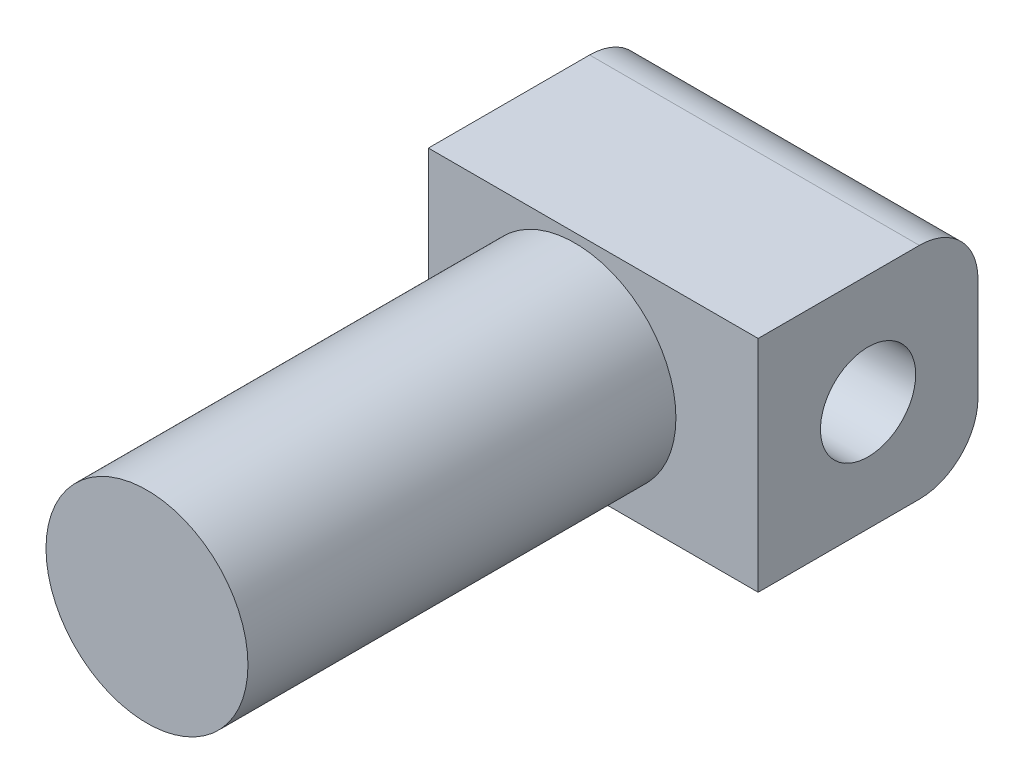
ISO-10303-21;
HEADER;
FILE_DESCRIPTION(('STEP AP214'),'2;1');
FILE_NAME('part.step','',(''),(''),'','','');
FILE_SCHEMA(('AUTOMOTIVE_DESIGN { 1 0 10303 214 1 1 1 1 }'));
ENDSEC;
DATA;
#1=APPLICATION_CONTEXT('core data for automotive mechanical design processes');
#2=APPLICATION_PROTOCOL_DEFINITION('international standard','automotive_design',2000,#1);
#3=PRODUCT_CONTEXT('',#1,'mechanical');
#4=PRODUCT('Part','Part','',(#3));
#5=PRODUCT_RELATED_PRODUCT_CATEGORY('part','',(#4));
#6=PRODUCT_DEFINITION_FORMATION('','',#4);
#7=PRODUCT_DEFINITION_CONTEXT('part definition',#1,'design');
#8=PRODUCT_DEFINITION('design','',#6,#7);
#9=PRODUCT_DEFINITION_SHAPE('','',#8);
#10=(LENGTH_UNIT() NAMED_UNIT(*) SI_UNIT(.MILLI.,.METRE.));
#11=(NAMED_UNIT(*) PLANE_ANGLE_UNIT() SI_UNIT($,.RADIAN.));
#12=(NAMED_UNIT(*) SI_UNIT($,.STERADIAN.) SOLID_ANGLE_UNIT());
#13=UNCERTAINTY_MEASURE_WITH_UNIT(LENGTH_MEASURE(1.E-05),#10,'distance_accuracy_value','');
#14=(GEOMETRIC_REPRESENTATION_CONTEXT(3) GLOBAL_UNCERTAINTY_ASSIGNED_CONTEXT((#13)) GLOBAL_UNIT_ASSIGNED_CONTEXT((#10,
#11,#12)) REPRESENTATION_CONTEXT('',''));
#15=CARTESIAN_POINT('',(0.,0.,0.));
#16=DIRECTION('',(0.,0.,1.));
#17=DIRECTION('',(1.,0.,0.));
#18=AXIS2_PLACEMENT_3D('',#15,#16,#17);
#19=CARTESIAN_POINT('',(0.,0.,7.62));
#20=DIRECTION('',(0.,-1.,0.));
#21=DIRECTION('',(1.,0.,0.));
#22=AXIS2_PLACEMENT_3D('',#19,#20,#21);
#23=PLANE('',#22);
#24=DIRECTION('',(0.,0.,-1.));
#25=VECTOR('',#24,1.);
#26=CARTESIAN_POINT('',(0.,0.,7.62));
#27=LINE('',#26,#25);
#28=CARTESIAN_POINT('',(0.,0.,7.62));
#29=VERTEX_POINT('',#28);
#30=CARTESIAN_POINT('',(0.,0.,2.032));
#31=VERTEX_POINT('',#30);
#32=EDGE_CURVE('E156',#29,#31,#27,.T.);
#33=ORIENTED_EDGE('',*,*,#32,.T.);
#34=DIRECTION('',(-1.,0.,0.));
#35=VECTOR('',#34,1.);
#36=CARTESIAN_POINT('',(0.,0.,2.032));
#37=LINE('',#36,#35);
#38=CARTESIAN_POINT('',(-11.43,0.,2.032));
#39=VERTEX_POINT('',#38);
#40=EDGE_CURVE('E126',#31,#39,#37,.T.);
#41=ORIENTED_EDGE('',*,*,#40,.T.);
#42=DIRECTION('',(0.,0.,-1.));
#43=VECTOR('',#42,1.);
#44=CARTESIAN_POINT('',(-11.43,0.,7.62));
#45=LINE('',#44,#43);
#46=CARTESIAN_POINT('',(-11.43,0.,7.62));
#47=VERTEX_POINT('',#46);
#48=EDGE_CURVE('E105',#47,#39,#45,.T.);
#49=ORIENTED_EDGE('',*,*,#48,.F.);
#50=DIRECTION('',(-1.,0.,0.));
#51=VECTOR('',#50,1.);
#52=CARTESIAN_POINT('',(0.,0.,7.62));
#53=LINE('',#52,#51);
#54=EDGE_CURVE('E112',#29,#47,#53,.T.);
#55=ORIENTED_EDGE('',*,*,#54,.F.);
#56=EDGE_LOOP('',(#33,#41,#49,#55));
#57=FACE_BOUND('',#56,.T.);
#58=ADVANCED_FACE('F45',(#57),#23,.F.);
#59=CARTESIAN_POINT('',(-11.43,0.,7.62));
#60=DIRECTION('',(1.,0.,0.));
#61=DIRECTION('',(0.,1.,0.));
#62=AXIS2_PLACEMENT_3D('',#59,#60,#61);
#63=PLANE('',#62);
#64=CARTESIAN_POINT('',(-11.43,-3.81,3.81));
#65=DIRECTION('',(1.,0.,0.));
#66=DIRECTION('',(0.,0.,-1.));
#67=AXIS2_PLACEMENT_3D('',#64,#65,#66);
#68=CIRCLE('',#67,1.65);
#69=CARTESIAN_POINT('',(-11.43,-3.81,2.16));
#70=VERTEX_POINT('',#69);
#71=EDGE_CURVE('E172',#70,#70,#68,.T.);
#72=ORIENTED_EDGE('',*,*,#71,.T.);
#73=EDGE_LOOP('',(#72));
#74=FACE_BOUND('',#73,.T.);
#75=ORIENTED_EDGE('',*,*,#48,.T.);
#76=CARTESIAN_POINT('',(-11.43,-2.032,2.032));
#77=DIRECTION('',(1.,0.,0.));
#78=DIRECTION('',(0.,1.,0.));
#79=AXIS2_PLACEMENT_3D('',#76,#77,#78);
#80=CIRCLE('',#79,2.032);
#81=CARTESIAN_POINT('',(-11.43,-2.032,0.));
#82=VERTEX_POINT('',#81);
#83=EDGE_CURVE('E143',#39,#82,#80,.F.);
#84=ORIENTED_EDGE('',*,*,#83,.T.);
#85=DIRECTION('',(0.,-1.,0.));
#86=VECTOR('',#85,1.);
#87=CARTESIAN_POINT('',(-11.43,0.,0.));
#88=LINE('',#87,#86);
#89=CARTESIAN_POINT('',(-11.43,-5.588,0.));
#90=VERTEX_POINT('',#89);
#91=EDGE_CURVE('E162',#82,#90,#88,.T.);
#92=ORIENTED_EDGE('',*,*,#91,.T.);
#93=CARTESIAN_POINT('',(-11.43,-5.588,2.032));
#94=DIRECTION('',(1.,0.,0.));
#95=DIRECTION('',(0.,1.,0.));
#96=AXIS2_PLACEMENT_3D('',#93,#94,#95);
#97=CIRCLE('',#96,2.032);
#98=CARTESIAN_POINT('',(-11.43,-7.62,2.032));
#99=VERTEX_POINT('',#98);
#100=EDGE_CURVE('E140',#90,#99,#97,.F.);
#101=ORIENTED_EDGE('',*,*,#100,.T.);
#102=DIRECTION('',(0.,0.,-1.));
#103=VECTOR('',#102,1.);
#104=CARTESIAN_POINT('',(-11.43,-7.62,7.62));
#105=LINE('',#104,#103);
#106=CARTESIAN_POINT('',(-11.43,-7.62,7.62));
#107=VERTEX_POINT('',#106);
#108=EDGE_CURVE('E107',#107,#99,#105,.T.);
#109=ORIENTED_EDGE('',*,*,#108,.F.);
#110=DIRECTION('',(0.,-1.,0.));
#111=VECTOR('',#110,1.);
#112=CARTESIAN_POINT('',(-11.43,0.,7.62));
#113=LINE('',#112,#111);
#114=EDGE_CURVE('E101',#47,#107,#113,.T.);
#115=ORIENTED_EDGE('',*,*,#114,.F.);
#116=EDGE_LOOP('',(#75,#84,#92,#101,#109,#115));
#117=FACE_BOUND('',#116,.T.);
#118=ADVANCED_FACE('F103',(#74,#117),#63,.F.);
#119=CARTESIAN_POINT('',(0.,-7.62,7.62));
#120=DIRECTION('',(0.,1.,0.));
#121=DIRECTION('',(0.,0.,1.));
#122=AXIS2_PLACEMENT_3D('',#119,#120,#121);
#123=PLANE('',#122);
#124=ORIENTED_EDGE('',*,*,#108,.T.);
#125=DIRECTION('',(1.,0.,0.));
#126=VECTOR('',#125,1.);
#127=CARTESIAN_POINT('',(0.,-7.62,2.032));
#128=LINE('',#127,#126);
#129=CARTESIAN_POINT('',(0.,-7.62,2.032));
#130=VERTEX_POINT('',#129);
#131=EDGE_CURVE('E11',#99,#130,#128,.T.);
#132=ORIENTED_EDGE('',*,*,#131,.T.);
#133=DIRECTION('',(0.,0.,-1.));
#134=VECTOR('',#133,1.);
#135=CARTESIAN_POINT('',(0.,-7.62,7.62));
#136=LINE('',#135,#134);
#137=CARTESIAN_POINT('',(0.,-7.62,7.62));
#138=VERTEX_POINT('',#137);
#139=EDGE_CURVE('E134',#138,#130,#136,.T.);
#140=ORIENTED_EDGE('',*,*,#139,.F.);
#141=DIRECTION('',(1.,0.,0.));
#142=VECTOR('',#141,1.);
#143=CARTESIAN_POINT('',(0.,-7.62,7.62));
#144=LINE('',#143,#142);
#145=EDGE_CURVE('E111',#107,#138,#144,.T.);
#146=ORIENTED_EDGE('',*,*,#145,.F.);
#147=EDGE_LOOP('',(#124,#132,#140,#146));
#148=FACE_BOUND('',#147,.T.);
#149=ADVANCED_FACE('F180',(#148),#123,.F.);
#150=CARTESIAN_POINT('',(0.,0.,7.62));
#151=DIRECTION('',(-1.,0.,0.));
#152=DIRECTION('',(0.,0.,1.));
#153=AXIS2_PLACEMENT_3D('',#150,#151,#152);
#154=PLANE('',#153);
#155=CARTESIAN_POINT('',(0.,-3.81,3.81));
#156=DIRECTION('',(1.,0.,0.));
#157=DIRECTION('',(0.,0.,-1.));
#158=AXIS2_PLACEMENT_3D('',#155,#156,#157);
#159=CIRCLE('',#158,1.64999999999999);
#160=CARTESIAN_POINT('',(0.,-3.81,2.16000000000001));
#161=VERTEX_POINT('',#160);
#162=EDGE_CURVE('E221',#161,#161,#159,.T.);
#163=ORIENTED_EDGE('',*,*,#162,.F.);
#164=EDGE_LOOP('',(#163));
#165=FACE_BOUND('',#164,.T.);
#166=DIRECTION('',(0.,1.,0.));
#167=VECTOR('',#166,1.);
#168=CARTESIAN_POINT('',(0.,0.,0.));
#169=LINE('',#168,#167);
#170=CARTESIAN_POINT('',(0.,-5.588,0.));
#171=VERTEX_POINT('',#170);
#172=CARTESIAN_POINT('',(0.,-2.032,0.));
#173=VERTEX_POINT('',#172);
#174=EDGE_CURVE('E122',#171,#173,#169,.T.);
#175=ORIENTED_EDGE('',*,*,#174,.T.);
#176=CARTESIAN_POINT('',(0.,-2.032,2.032));
#177=DIRECTION('',(-1.,0.,0.));
#178=DIRECTION('',(0.,0.,1.));
#179=AXIS2_PLACEMENT_3D('',#176,#177,#178);
#180=CIRCLE('',#179,2.032);
#181=EDGE_CURVE('E54',#173,#31,#180,.F.);
#182=ORIENTED_EDGE('',*,*,#181,.T.);
#183=ORIENTED_EDGE('',*,*,#32,.F.);
#184=DIRECTION('',(0.,1.,0.));
#185=VECTOR('',#184,1.);
#186=CARTESIAN_POINT('',(0.,0.,7.62));
#187=LINE('',#186,#185);
#188=EDGE_CURVE('E117',#138,#29,#187,.T.);
#189=ORIENTED_EDGE('',*,*,#188,.F.);
#190=ORIENTED_EDGE('',*,*,#139,.T.);
#191=CARTESIAN_POINT('',(0.,-5.588,2.032));
#192=DIRECTION('',(-1.,0.,0.));
#193=DIRECTION('',(0.,0.,1.));
#194=AXIS2_PLACEMENT_3D('',#191,#192,#193);
#195=CIRCLE('',#194,2.032);
#196=EDGE_CURVE('E61',#130,#171,#195,.F.);
#197=ORIENTED_EDGE('',*,*,#196,.T.);
#198=EDGE_LOOP('',(#175,#182,#183,#189,#190,#197));
#199=FACE_BOUND('',#198,.T.);
#200=ADVANCED_FACE('F155',(#165,#199),#154,.F.);
#201=CARTESIAN_POINT('',(0.,0.,7.62));
#202=DIRECTION('',(0.,0.,1.));
#203=DIRECTION('',(1.,0.,0.));
#204=AXIS2_PLACEMENT_3D('',#201,#202,#203);
#205=PLANE('',#204);
#206=CARTESIAN_POINT('',(-6.35,-3.81,7.62));
#207=DIRECTION('',(0.,0.,1.));
#208=DIRECTION('',(1.,0.,0.));
#209=AXIS2_PLACEMENT_3D('',#206,#207,#208);
#210=CIRCLE('',#209,3.499999985);
#211=CARTESIAN_POINT('',(-2.850000015,-3.81,7.62));
#212=VERTEX_POINT('',#211);
#213=EDGE_CURVE('E128',#212,#212,#210,.T.);
#214=ORIENTED_EDGE('',*,*,#213,.F.);
#215=EDGE_LOOP('',(#214));
#216=FACE_BOUND('',#215,.T.);
#217=ORIENTED_EDGE('',*,*,#54,.T.);
#218=ORIENTED_EDGE('',*,*,#114,.T.);
#219=ORIENTED_EDGE('',*,*,#145,.T.);
#220=ORIENTED_EDGE('',*,*,#188,.T.);
#221=EDGE_LOOP('',(#217,#218,#219,#220));
#222=FACE_BOUND('',#221,.T.);
#223=ADVANCED_FACE('F115',(#216,#222),#205,.T.);
#224=CARTESIAN_POINT('',(0.,0.,0.));
#225=DIRECTION('',(0.,0.,1.));
#226=DIRECTION('',(1.,0.,0.));
#227=AXIS2_PLACEMENT_3D('',#224,#225,#226);
#228=PLANE('',#227);
#229=ORIENTED_EDGE('',*,*,#91,.F.);
#230=DIRECTION('',(-1.,0.,0.));
#231=VECTOR('',#230,1.);
#232=CARTESIAN_POINT('',(0.,-2.032,0.));
#233=LINE('',#232,#231);
#234=EDGE_CURVE('E68',#82,#173,#233,.F.);
#235=ORIENTED_EDGE('',*,*,#234,.T.);
#236=ORIENTED_EDGE('',*,*,#174,.F.);
#237=DIRECTION('',(1.,0.,0.));
#238=VECTOR('',#237,1.);
#239=CARTESIAN_POINT('',(0.,-5.588,0.));
#240=LINE('',#239,#238);
#241=EDGE_CURVE('E146',#171,#90,#240,.F.);
#242=ORIENTED_EDGE('',*,*,#241,.T.);
#243=EDGE_LOOP('',(#229,#235,#236,#242));
#244=FACE_BOUND('',#243,.T.);
#245=ADVANCED_FACE('F164',(#244),#228,.F.);
#246=CARTESIAN_POINT('',(-6.35,-3.81,22.4536));
#247=DIRECTION('',(0.,0.,-1.));
#248=DIRECTION('',(-1.,0.,0.));
#249=AXIS2_PLACEMENT_3D('',#246,#247,#248);
#250=CYLINDRICAL_SURFACE('',#249,3.499999985);
#251=CARTESIAN_POINT('',(-6.35,-3.81,22.4536));
#252=DIRECTION('',(0.,0.,1.));
#253=DIRECTION('',(1.,0.,0.));
#254=AXIS2_PLACEMENT_3D('',#251,#252,#253);
#255=CIRCLE('',#254,3.499999985);
#256=CARTESIAN_POINT('',(-2.850000015,-3.81,22.4536));
#257=VERTEX_POINT('',#256);
#258=EDGE_CURVE('E166',#257,#257,#255,.T.);
#259=ORIENTED_EDGE('',*,*,#258,.F.);
#260=EDGE_LOOP('',(#259));
#261=FACE_BOUND('',#260,.T.);
#262=ORIENTED_EDGE('',*,*,#213,.T.);
#263=EDGE_LOOP('',(#262));
#264=FACE_BOUND('',#263,.T.);
#265=ADVANCED_FACE('F202',(#261,#264),#250,.T.);
#266=CARTESIAN_POINT('',(-6.35,-3.81,22.4536));
#267=DIRECTION('',(0.,0.,1.));
#268=DIRECTION('',(1.,0.,0.));
#269=AXIS2_PLACEMENT_3D('',#266,#267,#268);
#270=PLANE('',#269);
#271=ORIENTED_EDGE('',*,*,#258,.T.);
#272=EDGE_LOOP('',(#271));
#273=FACE_BOUND('',#272,.T.);
#274=ADVANCED_FACE('F208',(#273),#270,.T.);
#275=CARTESIAN_POINT('',(0.,-3.81,3.81));
#276=DIRECTION('',(1.,0.,0.));
#277=DIRECTION('',(0.,0.,-1.));
#278=AXIS2_PLACEMENT_3D('',#275,#276,#277);
#279=CYLINDRICAL_SURFACE('',#278,1.64999999999999);
#280=ORIENTED_EDGE('',*,*,#71,.F.);
#281=EDGE_LOOP('',(#280));
#282=FACE_BOUND('',#281,.T.);
#283=ORIENTED_EDGE('',*,*,#162,.T.);
#284=EDGE_LOOP('',(#283));
#285=FACE_BOUND('',#284,.T.);
#286=ADVANCED_FACE('F185',(#282,#285),#279,.F.);
#287=CARTESIAN_POINT('',(0.,-2.032,2.032));
#288=DIRECTION('',(-1.,0.,0.));
#289=DIRECTION('',(0.,-1.,0.));
#290=AXIS2_PLACEMENT_3D('',#287,#288,#289);
#291=CYLINDRICAL_SURFACE('',#290,2.032);
#292=ORIENTED_EDGE('',*,*,#181,.F.);
#293=ORIENTED_EDGE('',*,*,#234,.F.);
#294=ORIENTED_EDGE('',*,*,#83,.F.);
#295=ORIENTED_EDGE('',*,*,#40,.F.);
#296=EDGE_LOOP('',(#292,#293,#294,#295));
#297=FACE_BOUND('',#296,.T.);
#298=ADVANCED_FACE('F160',(#297),#291,.T.);
#299=CARTESIAN_POINT('',(0.,-5.588,2.032));
#300=DIRECTION('',(1.,0.,0.));
#301=DIRECTION('',(0.,0.,-1.));
#302=AXIS2_PLACEMENT_3D('',#299,#300,#301);
#303=CYLINDRICAL_SURFACE('',#302,2.032);
#304=ORIENTED_EDGE('',*,*,#100,.F.);
#305=ORIENTED_EDGE('',*,*,#241,.F.);
#306=ORIENTED_EDGE('',*,*,#196,.F.);
#307=ORIENTED_EDGE('',*,*,#131,.F.);
#308=EDGE_LOOP('',(#304,#305,#306,#307));
#309=FACE_BOUND('',#308,.T.);
#310=ADVANCED_FACE('F47',(#309),#303,.T.);
#311=CLOSED_SHELL('',(#58,#118,#149,#200,#223,#245,#265,#274,#286,#298,#310));
#312=MANIFOLD_SOLID_BREP('B2',#311);
#313=ADVANCED_BREP_SHAPE_REPRESENTATION('',(#18,#312),#14);
#314=SHAPE_DEFINITION_REPRESENTATION(#9,#313);
ENDSEC;
END-ISO-10303-21;
